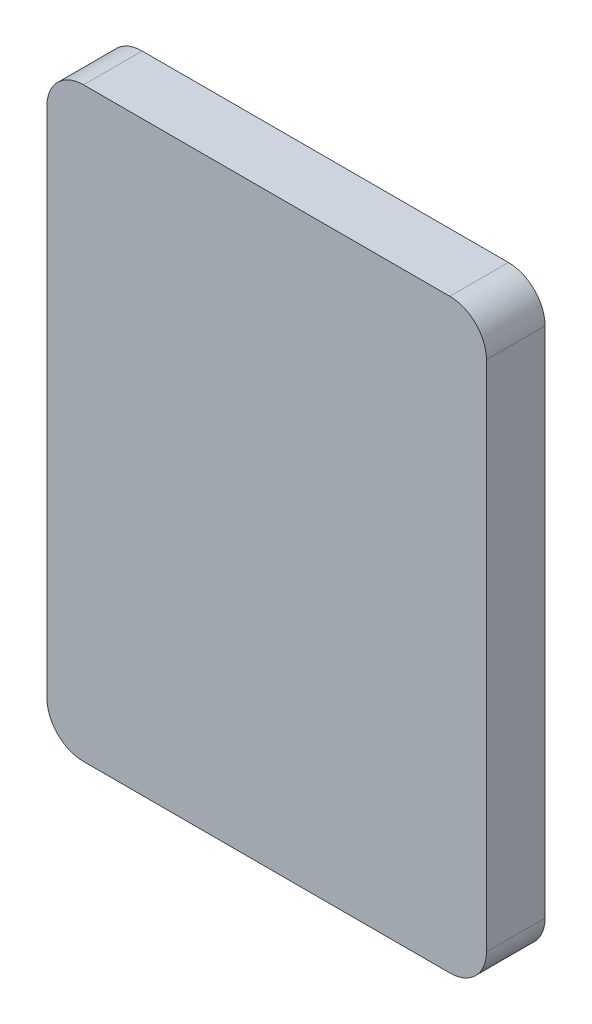
ISO-10303-21;
HEADER;
FILE_DESCRIPTION(('STEP AP214'),'2;1');
FILE_NAME('part.step','',(''),(''),'','','');
FILE_SCHEMA(('AUTOMOTIVE_DESIGN { 1 0 10303 214 1 1 1 1 }'));
ENDSEC;
DATA;
#1=APPLICATION_CONTEXT('core data for automotive mechanical design processes');
#2=APPLICATION_PROTOCOL_DEFINITION('international standard','automotive_design',2000,#1);
#3=PRODUCT_CONTEXT('',#1,'mechanical');
#4=PRODUCT('Part','Part','',(#3));
#5=PRODUCT_RELATED_PRODUCT_CATEGORY('part','',(#4));
#6=PRODUCT_DEFINITION_FORMATION('','',#4);
#7=PRODUCT_DEFINITION_CONTEXT('part definition',#1,'design');
#8=PRODUCT_DEFINITION('design','',#6,#7);
#9=PRODUCT_DEFINITION_SHAPE('','',#8);
#10=(LENGTH_UNIT() NAMED_UNIT(*) SI_UNIT(.MILLI.,.METRE.));
#11=(NAMED_UNIT(*) PLANE_ANGLE_UNIT() SI_UNIT($,.RADIAN.));
#12=(NAMED_UNIT(*) SI_UNIT($,.STERADIAN.) SOLID_ANGLE_UNIT());
#13=UNCERTAINTY_MEASURE_WITH_UNIT(LENGTH_MEASURE(1.E-05),#10,'distance_accuracy_value','');
#14=(GEOMETRIC_REPRESENTATION_CONTEXT(3) GLOBAL_UNCERTAINTY_ASSIGNED_CONTEXT((#13)) GLOBAL_UNIT_ASSIGNED_CONTEXT((#10,
#11,#12)) REPRESENTATION_CONTEXT('',''));
#15=CARTESIAN_POINT('',(0.,0.,0.));
#16=DIRECTION('',(0.,0.,1.));
#17=DIRECTION('',(1.,0.,0.));
#18=AXIS2_PLACEMENT_3D('',#15,#16,#17);
#19=CARTESIAN_POINT('',(-0.290605064789645,139.7,2.54));
#20=DIRECTION('',(0.,0.,1.));
#21=DIRECTION('',(1.,0.,0.));
#22=AXIS2_PLACEMENT_3D('',#19,#20,#21);
#23=PLANE('',#22);
#24=CARTESIAN_POINT('',(7.64689493521035,128.5875,2.54));
#25=DIRECTION('',(0.,0.,-1.));
#26=DIRECTION('',(0.707106781186552,-0.707106781186543,0.));
#27=AXIS2_PLACEMENT_3D('',#24,#25,#26);
#28=CIRCLE('',#27,1.5875);
#29=CARTESIAN_POINT('',(9.23439493521035,128.5875,2.54));
#30=VERTEX_POINT('',#29);
#31=CARTESIAN_POINT('',(7.64689493521035,127.,2.54));
#32=VERTEX_POINT('',#31);
#33=EDGE_CURVE('E184',#30,#32,#28,.T.);
#34=ORIENTED_EDGE('',*,*,#33,.F.);
#35=DIRECTION('',(0.,1.,0.));
#36=VECTOR('',#35,1.);
#37=CARTESIAN_POINT('',(9.23439493521035,127.,2.54));
#38=LINE('',#37,#36);
#39=CARTESIAN_POINT('',(9.23439493521035,150.8125,2.54));
#40=VERTEX_POINT('',#39);
#41=EDGE_CURVE('E157',#30,#40,#38,.T.);
#42=ORIENTED_EDGE('',*,*,#41,.T.);
#43=CARTESIAN_POINT('',(7.64689493521035,150.8125,2.54));
#44=DIRECTION('',(0.,0.,-1.));
#45=DIRECTION('',(0.707106781186545,0.70710678118655,0.));
#46=AXIS2_PLACEMENT_3D('',#43,#44,#45);
#47=CIRCLE('',#46,1.5875);
#48=CARTESIAN_POINT('',(7.64689493521035,152.4,2.54));
#49=VERTEX_POINT('',#48);
#50=EDGE_CURVE('E120',#49,#40,#47,.T.);
#51=ORIENTED_EDGE('',*,*,#50,.F.);
#52=DIRECTION('',(-1.,0.,0.));
#53=VECTOR('',#52,1.);
#54=CARTESIAN_POINT('',(9.23439493521035,152.4,2.54));
#55=LINE('',#54,#53);
#56=CARTESIAN_POINT('',(-8.22810506478965,152.4,2.54));
#57=VERTEX_POINT('',#56);
#58=EDGE_CURVE('E20',#49,#57,#55,.T.);
#59=ORIENTED_EDGE('',*,*,#58,.T.);
#60=CARTESIAN_POINT('',(-8.22810506478965,150.8125,2.54));
#61=DIRECTION('',(0.,0.,-1.));
#62=DIRECTION('',(-0.707106781186552,0.707106781186543,0.));
#63=AXIS2_PLACEMENT_3D('',#60,#61,#62);
#64=CIRCLE('',#63,1.5875);
#65=CARTESIAN_POINT('',(-9.81560506478965,150.8125,2.54));
#66=VERTEX_POINT('',#65);
#67=EDGE_CURVE('E78',#66,#57,#64,.T.);
#68=ORIENTED_EDGE('',*,*,#67,.F.);
#69=DIRECTION('',(0.,-1.,0.));
#70=VECTOR('',#69,1.);
#71=CARTESIAN_POINT('',(-9.81560506478965,152.4,2.54));
#72=LINE('',#71,#70);
#73=CARTESIAN_POINT('',(-9.81560506478965,128.5875,2.54));
#74=VERTEX_POINT('',#73);
#75=EDGE_CURVE('E72',#66,#74,#72,.T.);
#76=ORIENTED_EDGE('',*,*,#75,.T.);
#77=CARTESIAN_POINT('',(-8.22810506478965,128.5875,2.54));
#78=DIRECTION('',(0.,0.,-1.));
#79=DIRECTION('',(-0.707106781186545,-0.70710678118655,0.));
#80=AXIS2_PLACEMENT_3D('',#77,#78,#79);
#81=CIRCLE('',#80,1.5875);
#82=CARTESIAN_POINT('',(-8.22810506478965,127.,2.54));
#83=VERTEX_POINT('',#82);
#84=EDGE_CURVE('E76',#83,#74,#81,.T.);
#85=ORIENTED_EDGE('',*,*,#84,.F.);
#86=DIRECTION('',(1.,0.,0.));
#87=VECTOR('',#86,1.);
#88=CARTESIAN_POINT('',(-9.81560506478965,127.,2.54));
#89=LINE('',#88,#87);
#90=EDGE_CURVE('E11',#83,#32,#89,.T.);
#91=ORIENTED_EDGE('',*,*,#90,.T.);
#92=EDGE_LOOP('',(#34,#42,#51,#59,#68,#76,#85,#91));
#93=FACE_BOUND('',#92,.T.);
#94=ADVANCED_FACE('F17',(#93),#23,.T.);
#95=CARTESIAN_POINT('',(-9.81560506478965,127.,0.));
#96=DIRECTION('',(0.,-1.,0.));
#97=DIRECTION('',(0.,0.,-1.));
#98=AXIS2_PLACEMENT_3D('',#95,#96,#97);
#99=PLANE('',#98);
#100=DIRECTION('',(0.,0.,-1.));
#101=VECTOR('',#100,1.);
#102=CARTESIAN_POINT('',(7.64689493521035,127.,0.));
#103=LINE('',#102,#101);
#104=CARTESIAN_POINT('',(7.64689493521035,127.,0.));
#105=VERTEX_POINT('',#104);
#106=EDGE_CURVE('E179',#32,#105,#103,.T.);
#107=ORIENTED_EDGE('',*,*,#106,.F.);
#108=ORIENTED_EDGE('',*,*,#90,.F.);
#109=DIRECTION('',(0.,0.,1.));
#110=VECTOR('',#109,1.);
#111=CARTESIAN_POINT('',(-8.22810506478965,127.,0.));
#112=LINE('',#111,#110);
#113=CARTESIAN_POINT('',(-8.22810506478965,127.,0.));
#114=VERTEX_POINT('',#113);
#115=EDGE_CURVE('E83',#114,#83,#112,.T.);
#116=ORIENTED_EDGE('',*,*,#115,.F.);
#117=DIRECTION('',(1.,0.,0.));
#118=VECTOR('',#117,1.);
#119=CARTESIAN_POINT('',(-9.81560506478965,127.,0.));
#120=LINE('',#119,#118);
#121=EDGE_CURVE('E152',#114,#105,#120,.T.);
#122=ORIENTED_EDGE('',*,*,#121,.T.);
#123=EDGE_LOOP('',(#107,#108,#116,#122));
#124=FACE_BOUND('',#123,.T.);
#125=ADVANCED_FACE('F223',(#124),#99,.T.);
#126=CARTESIAN_POINT('',(9.23439493521035,152.4,0.));
#127=DIRECTION('',(0.,1.,0.));
#128=DIRECTION('',(1.,0.,0.));
#129=AXIS2_PLACEMENT_3D('',#126,#127,#128);
#130=PLANE('',#129);
#131=DIRECTION('',(0.,0.,-1.));
#132=VECTOR('',#131,1.);
#133=CARTESIAN_POINT('',(-8.22810506478965,152.4,0.));
#134=LINE('',#133,#132);
#135=CARTESIAN_POINT('',(-8.22810506478965,152.4,0.));
#136=VERTEX_POINT('',#135);
#137=EDGE_CURVE('E117',#57,#136,#134,.T.);
#138=ORIENTED_EDGE('',*,*,#137,.F.);
#139=ORIENTED_EDGE('',*,*,#58,.F.);
#140=DIRECTION('',(0.,0.,1.));
#141=VECTOR('',#140,1.);
#142=CARTESIAN_POINT('',(7.64689493521035,152.4,0.));
#143=LINE('',#142,#141);
#144=CARTESIAN_POINT('',(7.64689493521035,152.4,0.));
#145=VERTEX_POINT('',#144);
#146=EDGE_CURVE('E123',#145,#49,#143,.T.);
#147=ORIENTED_EDGE('',*,*,#146,.F.);
#148=DIRECTION('',(-1.,0.,0.));
#149=VECTOR('',#148,1.);
#150=CARTESIAN_POINT('',(9.23439493521035,152.4,0.));
#151=LINE('',#150,#149);
#152=EDGE_CURVE('E106',#145,#136,#151,.T.);
#153=ORIENTED_EDGE('',*,*,#152,.T.);
#154=EDGE_LOOP('',(#138,#139,#147,#153));
#155=FACE_BOUND('',#154,.T.);
#156=ADVANCED_FACE('F134',(#155),#130,.T.);
#157=CARTESIAN_POINT('',(7.64689493521035,150.8125,0.));
#158=DIRECTION('',(0.,0.,1.));
#159=DIRECTION('',(0.707106781186545,0.70710678118655,0.));
#160=AXIS2_PLACEMENT_3D('',#157,#158,#159);
#161=CYLINDRICAL_SURFACE('',#160,1.5875);
#162=ORIENTED_EDGE('',*,*,#50,.T.);
#163=DIRECTION('',(0.,0.,-1.));
#164=VECTOR('',#163,1.);
#165=CARTESIAN_POINT('',(9.23439493521035,150.8125,0.));
#166=LINE('',#165,#164);
#167=CARTESIAN_POINT('',(9.23439493521035,150.8125,0.));
#168=VERTEX_POINT('',#167);
#169=EDGE_CURVE('E164',#40,#168,#166,.T.);
#170=ORIENTED_EDGE('',*,*,#169,.T.);
#171=CARTESIAN_POINT('',(7.64689493521035,150.8125,0.));
#172=DIRECTION('',(0.,0.,1.));
#173=DIRECTION('',(0.707106781186545,0.70710678118655,0.));
#174=AXIS2_PLACEMENT_3D('',#171,#172,#173);
#175=CIRCLE('',#174,1.5875);
#176=EDGE_CURVE('E99',#168,#145,#175,.T.);
#177=ORIENTED_EDGE('',*,*,#176,.T.);
#178=ORIENTED_EDGE('',*,*,#146,.T.);
#179=EDGE_LOOP('',(#162,#170,#177,#178));
#180=FACE_BOUND('',#179,.T.);
#181=ADVANCED_FACE('F221',(#180),#161,.T.);
#182=CARTESIAN_POINT('',(-8.22810506478965,150.8125,0.));
#183=DIRECTION('',(0.,0.,1.));
#184=DIRECTION('',(-0.707106781186552,0.707106781186543,0.));
#185=AXIS2_PLACEMENT_3D('',#182,#183,#184);
#186=CYLINDRICAL_SURFACE('',#185,1.5875);
#187=ORIENTED_EDGE('',*,*,#67,.T.);
#188=ORIENTED_EDGE('',*,*,#137,.T.);
#189=CARTESIAN_POINT('',(-8.22810506478965,150.8125,0.));
#190=DIRECTION('',(0.,0.,1.));
#191=DIRECTION('',(-0.707106781186552,0.707106781186543,0.));
#192=AXIS2_PLACEMENT_3D('',#189,#190,#191);
#193=CIRCLE('',#192,1.5875);
#194=CARTESIAN_POINT('',(-9.81560506478965,150.8125,0.));
#195=VERTEX_POINT('',#194);
#196=EDGE_CURVE('E140',#136,#195,#193,.T.);
#197=ORIENTED_EDGE('',*,*,#196,.T.);
#198=DIRECTION('',(0.,0.,1.));
#199=VECTOR('',#198,1.);
#200=CARTESIAN_POINT('',(-9.81560506478965,150.8125,0.));
#201=LINE('',#200,#199);
#202=EDGE_CURVE('E82',#195,#66,#201,.T.);
#203=ORIENTED_EDGE('',*,*,#202,.T.);
#204=EDGE_LOOP('',(#187,#188,#197,#203));
#205=FACE_BOUND('',#204,.T.);
#206=ADVANCED_FACE('F139',(#205),#186,.T.);
#207=CARTESIAN_POINT('',(-9.81560506478965,152.4,0.));
#208=DIRECTION('',(-1.,0.,0.));
#209=DIRECTION('',(0.,1.,0.));
#210=AXIS2_PLACEMENT_3D('',#207,#208,#209);
#211=PLANE('',#210);
#212=DIRECTION('',(0.,0.,-1.));
#213=VECTOR('',#212,1.);
#214=CARTESIAN_POINT('',(-9.81560506478965,128.5875,0.));
#215=LINE('',#214,#213);
#216=CARTESIAN_POINT('',(-9.81560506478965,128.5875,0.));
#217=VERTEX_POINT('',#216);
#218=EDGE_CURVE('E86',#74,#217,#215,.T.);
#219=ORIENTED_EDGE('',*,*,#218,.F.);
#220=ORIENTED_EDGE('',*,*,#75,.F.);
#221=ORIENTED_EDGE('',*,*,#202,.F.);
#222=DIRECTION('',(0.,-1.,0.));
#223=VECTOR('',#222,1.);
#224=CARTESIAN_POINT('',(-9.81560506478965,152.4,0.));
#225=LINE('',#224,#223);
#226=EDGE_CURVE('E89',#195,#217,#225,.T.);
#227=ORIENTED_EDGE('',*,*,#226,.T.);
#228=EDGE_LOOP('',(#219,#220,#221,#227));
#229=FACE_BOUND('',#228,.T.);
#230=ADVANCED_FACE('F87',(#229),#211,.T.);
#231=CARTESIAN_POINT('',(-8.22810506478965,128.5875,0.));
#232=DIRECTION('',(0.,0.,1.));
#233=DIRECTION('',(-0.707106781186545,-0.70710678118655,0.));
#234=AXIS2_PLACEMENT_3D('',#231,#232,#233);
#235=CYLINDRICAL_SURFACE('',#234,1.5875);
#236=ORIENTED_EDGE('',*,*,#84,.T.);
#237=ORIENTED_EDGE('',*,*,#218,.T.);
#238=CARTESIAN_POINT('',(-8.22810506478965,128.5875,0.));
#239=DIRECTION('',(0.,0.,1.));
#240=DIRECTION('',(-0.707106781186545,-0.70710678118655,0.));
#241=AXIS2_PLACEMENT_3D('',#238,#239,#240);
#242=CIRCLE('',#241,1.5875);
#243=EDGE_CURVE('E147',#217,#114,#242,.T.);
#244=ORIENTED_EDGE('',*,*,#243,.T.);
#245=ORIENTED_EDGE('',*,*,#115,.T.);
#246=EDGE_LOOP('',(#236,#237,#244,#245));
#247=FACE_BOUND('',#246,.T.);
#248=ADVANCED_FACE('F96',(#247),#235,.T.);
#249=CARTESIAN_POINT('',(-0.290605064789645,139.7,0.));
#250=DIRECTION('',(0.,0.,1.));
#251=DIRECTION('',(1.,0.,0.));
#252=AXIS2_PLACEMENT_3D('',#249,#250,#251);
#253=PLANE('',#252);
#254=CARTESIAN_POINT('',(7.64689493521035,128.5875,0.));
#255=DIRECTION('',(0.,0.,1.));
#256=DIRECTION('',(0.707106781186552,-0.707106781186543,0.));
#257=AXIS2_PLACEMENT_3D('',#254,#255,#256);
#258=CIRCLE('',#257,1.5875);
#259=CARTESIAN_POINT('',(9.23439493521035,128.5875,0.));
#260=VERTEX_POINT('',#259);
#261=EDGE_CURVE('E176',#105,#260,#258,.T.);
#262=ORIENTED_EDGE('',*,*,#261,.F.);
#263=ORIENTED_EDGE('',*,*,#121,.F.);
#264=ORIENTED_EDGE('',*,*,#243,.F.);
#265=ORIENTED_EDGE('',*,*,#226,.F.);
#266=ORIENTED_EDGE('',*,*,#196,.F.);
#267=ORIENTED_EDGE('',*,*,#152,.F.);
#268=ORIENTED_EDGE('',*,*,#176,.F.);
#269=DIRECTION('',(0.,1.,0.));
#270=VECTOR('',#269,1.);
#271=CARTESIAN_POINT('',(9.23439493521035,127.,0.));
#272=LINE('',#271,#270);
#273=EDGE_CURVE('E168',#260,#168,#272,.T.);
#274=ORIENTED_EDGE('',*,*,#273,.F.);
#275=EDGE_LOOP('',(#262,#263,#264,#265,#266,#267,#268,#274));
#276=FACE_BOUND('',#275,.T.);
#277=ADVANCED_FACE('F145',(#276),#253,.F.);
#278=CARTESIAN_POINT('',(9.23439493521035,127.,0.));
#279=DIRECTION('',(1.,0.,0.));
#280=DIRECTION('',(0.,1.,0.));
#281=AXIS2_PLACEMENT_3D('',#278,#279,#280);
#282=PLANE('',#281);
#283=DIRECTION('',(0.,0.,1.));
#284=VECTOR('',#283,1.);
#285=CARTESIAN_POINT('',(9.23439493521035,128.5875,0.));
#286=LINE('',#285,#284);
#287=EDGE_CURVE('E171',#260,#30,#286,.T.);
#288=ORIENTED_EDGE('',*,*,#287,.F.);
#289=ORIENTED_EDGE('',*,*,#273,.T.);
#290=ORIENTED_EDGE('',*,*,#169,.F.);
#291=ORIENTED_EDGE('',*,*,#41,.F.);
#292=EDGE_LOOP('',(#288,#289,#290,#291));
#293=FACE_BOUND('',#292,.T.);
#294=ADVANCED_FACE('F222',(#293),#282,.T.);
#295=CARTESIAN_POINT('',(7.64689493521035,128.5875,0.));
#296=DIRECTION('',(0.,0.,1.));
#297=DIRECTION('',(0.707106781186552,-0.707106781186543,0.));
#298=AXIS2_PLACEMENT_3D('',#295,#296,#297);
#299=CYLINDRICAL_SURFACE('',#298,1.5875);
#300=ORIENTED_EDGE('',*,*,#33,.T.);
#301=ORIENTED_EDGE('',*,*,#106,.T.);
#302=ORIENTED_EDGE('',*,*,#261,.T.);
#303=ORIENTED_EDGE('',*,*,#287,.T.);
#304=EDGE_LOOP('',(#300,#301,#302,#303));
#305=FACE_BOUND('',#304,.T.);
#306=ADVANCED_FACE('F191',(#305),#299,.T.);
#307=CLOSED_SHELL('',(#94,#125,#156,#181,#206,#230,#248,#277,#294,#306));
#308=MANIFOLD_SOLID_BREP('B1',#307);
#309=ADVANCED_BREP_SHAPE_REPRESENTATION('',(#18,#308),#14);
#310=SHAPE_DEFINITION_REPRESENTATION(#9,#309);
ENDSEC;
END-ISO-10303-21;
